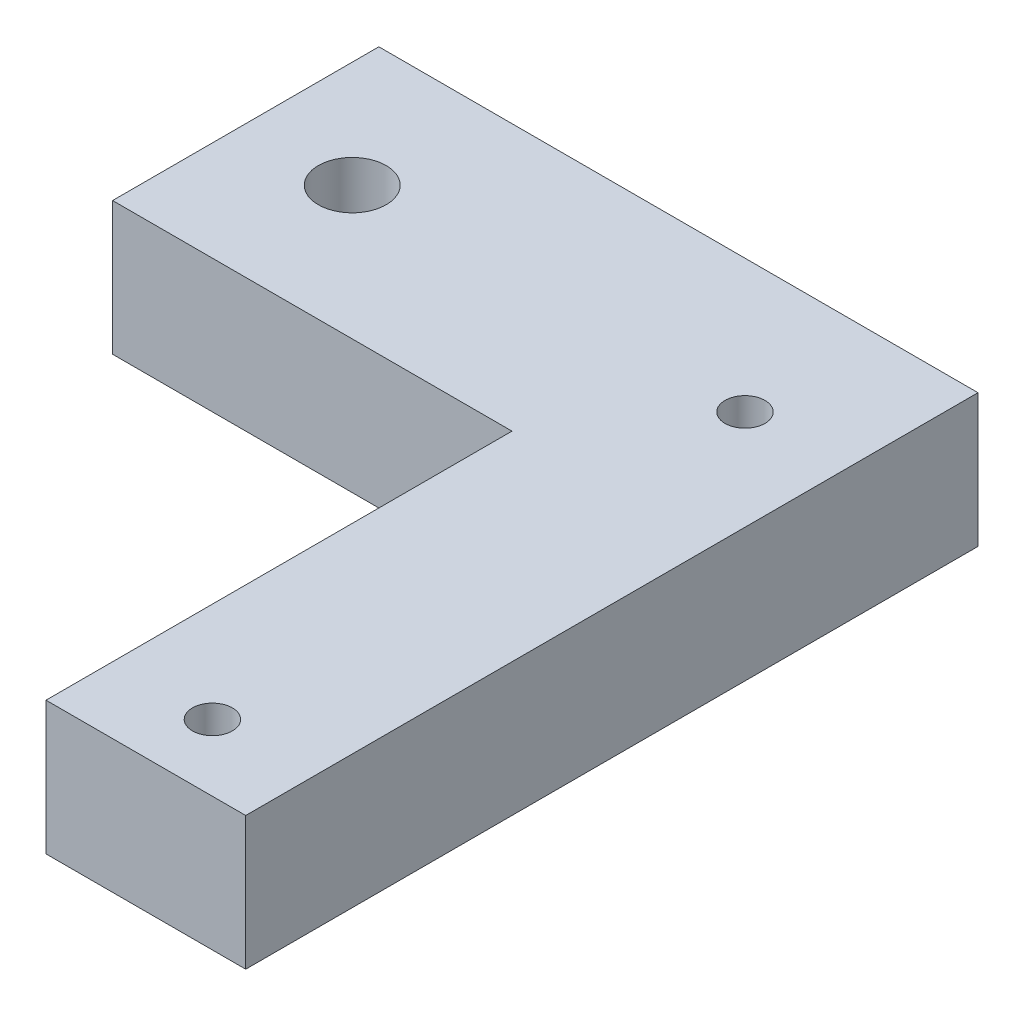
ISO-10303-21;
HEADER;
FILE_DESCRIPTION(('STEP AP214'),'2;1');
FILE_NAME('part.step','',(''),(''),'','','');
FILE_SCHEMA(('AUTOMOTIVE_DESIGN { 1 0 10303 214 1 1 1 1 }'));
ENDSEC;
DATA;
#1=APPLICATION_CONTEXT('core data for automotive mechanical design processes');
#2=APPLICATION_PROTOCOL_DEFINITION('international standard','automotive_design',2000,#1);
#3=PRODUCT_CONTEXT('',#1,'mechanical');
#4=PRODUCT('Part','Part','',(#3));
#5=PRODUCT_RELATED_PRODUCT_CATEGORY('part','',(#4));
#6=PRODUCT_DEFINITION_FORMATION('','',#4);
#7=PRODUCT_DEFINITION_CONTEXT('part definition',#1,'design');
#8=PRODUCT_DEFINITION('design','',#6,#7);
#9=PRODUCT_DEFINITION_SHAPE('','',#8);
#10=(LENGTH_UNIT() NAMED_UNIT(*) SI_UNIT(.MILLI.,.METRE.));
#11=(NAMED_UNIT(*) PLANE_ANGLE_UNIT() SI_UNIT($,.RADIAN.));
#12=(NAMED_UNIT(*) SI_UNIT($,.STERADIAN.) SOLID_ANGLE_UNIT());
#13=UNCERTAINTY_MEASURE_WITH_UNIT(LENGTH_MEASURE(1.E-05),#10,'distance_accuracy_value','');
#14=(GEOMETRIC_REPRESENTATION_CONTEXT(3) GLOBAL_UNCERTAINTY_ASSIGNED_CONTEXT((#13)) GLOBAL_UNIT_ASSIGNED_CONTEXT((#10,
#11,#12)) REPRESENTATION_CONTEXT('',''));
#15=CARTESIAN_POINT('',(0.,0.,0.));
#16=DIRECTION('',(0.,0.,1.));
#17=DIRECTION('',(1.,0.,0.));
#18=AXIS2_PLACEMENT_3D('',#15,#16,#17);
#19=CARTESIAN_POINT('',(7.5,10.,0.));
#20=DIRECTION('',(1.,0.,0.));
#21=DIRECTION('',(0.,0.,-1.));
#22=AXIS2_PLACEMENT_3D('',#19,#20,#21);
#23=PLANE('',#22);
#24=DIRECTION('',(0.,0.,1.));
#25=VECTOR('',#24,1.);
#26=CARTESIAN_POINT('',(7.5,0.,0.));
#27=LINE('',#26,#25);
#28=CARTESIAN_POINT('',(7.5,0.,-27.5));
#29=VERTEX_POINT('',#28);
#30=CARTESIAN_POINT('',(7.5,0.,27.5));
#31=VERTEX_POINT('',#30);
#32=EDGE_CURVE('E130',#29,#31,#27,.T.);
#33=ORIENTED_EDGE('',*,*,#32,.F.);
#34=DIRECTION('',(0.,-1.,0.));
#35=VECTOR('',#34,1.);
#36=CARTESIAN_POINT('',(7.5,10.,-27.5));
#37=LINE('',#36,#35);
#38=CARTESIAN_POINT('',(7.5,10.,-27.5));
#39=VERTEX_POINT('',#38);
#40=EDGE_CURVE('E11',#39,#29,#37,.T.);
#41=ORIENTED_EDGE('',*,*,#40,.F.);
#42=DIRECTION('',(0.,0.,1.));
#43=VECTOR('',#42,1.);
#44=CARTESIAN_POINT('',(7.5,10.,0.));
#45=LINE('',#44,#43);
#46=CARTESIAN_POINT('',(7.5,10.,27.5));
#47=VERTEX_POINT('',#46);
#48=EDGE_CURVE('E278',#39,#47,#45,.T.);
#49=ORIENTED_EDGE('',*,*,#48,.T.);
#50=DIRECTION('',(0.,-1.,0.));
#51=VECTOR('',#50,1.);
#52=CARTESIAN_POINT('',(7.5,10.,27.5));
#53=LINE('',#52,#51);
#54=EDGE_CURVE('E80',#47,#31,#53,.T.);
#55=ORIENTED_EDGE('',*,*,#54,.T.);
#56=EDGE_LOOP('',(#33,#41,#49,#55));
#57=FACE_BOUND('',#56,.T.);
#58=ADVANCED_FACE('F34',(#57),#23,.T.);
#59=CARTESIAN_POINT('',(0.,10.,-27.5));
#60=DIRECTION('',(0.,0.,-1.));
#61=DIRECTION('',(-1.,0.,0.));
#62=AXIS2_PLACEMENT_3D('',#59,#60,#61);
#63=PLANE('',#62);
#64=DIRECTION('',(1.,0.,0.));
#65=VECTOR('',#64,1.);
#66=CARTESIAN_POINT('',(0.,0.,-27.5));
#67=LINE('',#66,#65);
#68=CARTESIAN_POINT('',(-37.5,0.,-27.5));
#69=VERTEX_POINT('',#68);
#70=EDGE_CURVE('E132',#69,#29,#67,.T.);
#71=ORIENTED_EDGE('',*,*,#70,.F.);
#72=DIRECTION('',(0.,-1.,0.));
#73=VECTOR('',#72,1.);
#74=CARTESIAN_POINT('',(-37.5,10.,-27.5));
#75=LINE('',#74,#73);
#76=CARTESIAN_POINT('',(-37.5,10.,-27.5));
#77=VERTEX_POINT('',#76);
#78=EDGE_CURVE('E43',#77,#69,#75,.T.);
#79=ORIENTED_EDGE('',*,*,#78,.F.);
#80=DIRECTION('',(1.,0.,0.));
#81=VECTOR('',#80,1.);
#82=CARTESIAN_POINT('',(0.,10.,-27.5));
#83=LINE('',#82,#81);
#84=EDGE_CURVE('E116',#77,#39,#83,.T.);
#85=ORIENTED_EDGE('',*,*,#84,.T.);
#86=ORIENTED_EDGE('',*,*,#40,.T.);
#87=EDGE_LOOP('',(#71,#79,#85,#86));
#88=FACE_BOUND('',#87,.T.);
#89=ADVANCED_FACE('F156',(#88),#63,.T.);
#90=CARTESIAN_POINT('',(-37.5,10.,0.));
#91=DIRECTION('',(1.,0.,0.));
#92=DIRECTION('',(0.,0.,-1.));
#93=AXIS2_PLACEMENT_3D('',#90,#91,#92);
#94=PLANE('',#93);
#95=DIRECTION('',(0.,0.,1.));
#96=VECTOR('',#95,1.);
#97=CARTESIAN_POINT('',(-37.5,0.,0.));
#98=LINE('',#97,#96);
#99=CARTESIAN_POINT('',(-37.5,0.,-7.49999999999999));
#100=VERTEX_POINT('',#99);
#101=EDGE_CURVE('E135',#69,#100,#98,.T.);
#102=ORIENTED_EDGE('',*,*,#101,.T.);
#103=DIRECTION('',(0.,-1.,0.));
#104=VECTOR('',#103,1.);
#105=CARTESIAN_POINT('',(-37.5,10.,-7.49999999999999));
#106=LINE('',#105,#104);
#107=CARTESIAN_POINT('',(-37.5,10.,-7.49999999999999));
#108=VERTEX_POINT('',#107);
#109=EDGE_CURVE('E102',#108,#100,#106,.T.);
#110=ORIENTED_EDGE('',*,*,#109,.F.);
#111=DIRECTION('',(0.,0.,1.));
#112=VECTOR('',#111,1.);
#113=CARTESIAN_POINT('',(-37.5,10.,0.));
#114=LINE('',#113,#112);
#115=EDGE_CURVE('E113',#77,#108,#114,.T.);
#116=ORIENTED_EDGE('',*,*,#115,.F.);
#117=ORIENTED_EDGE('',*,*,#78,.T.);
#118=EDGE_LOOP('',(#102,#110,#116,#117));
#119=FACE_BOUND('',#118,.T.);
#120=ADVANCED_FACE('F150',(#119),#94,.F.);
#121=CARTESIAN_POINT('',(0.,10.,-7.49999999999999));
#122=DIRECTION('',(0.,0.,1.));
#123=DIRECTION('',(1.,0.,0.));
#124=AXIS2_PLACEMENT_3D('',#121,#122,#123);
#125=PLANE('',#124);
#126=DIRECTION('',(-1.,0.,0.));
#127=VECTOR('',#126,1.);
#128=CARTESIAN_POINT('',(0.,0.,-7.49999999999999));
#129=LINE('',#128,#127);
#130=CARTESIAN_POINT('',(-7.5,0.,-7.49999999999999));
#131=VERTEX_POINT('',#130);
#132=EDGE_CURVE('E99',#131,#100,#129,.T.);
#133=ORIENTED_EDGE('',*,*,#132,.F.);
#134=DIRECTION('',(0.,-1.,0.));
#135=VECTOR('',#134,1.);
#136=CARTESIAN_POINT('',(-7.5,10.,-7.49999999999999));
#137=LINE('',#136,#135);
#138=CARTESIAN_POINT('',(-7.5,10.,-7.49999999999999));
#139=VERTEX_POINT('',#138);
#140=EDGE_CURVE('E93',#139,#131,#137,.T.);
#141=ORIENTED_EDGE('',*,*,#140,.F.);
#142=DIRECTION('',(-1.,0.,0.));
#143=VECTOR('',#142,1.);
#144=CARTESIAN_POINT('',(0.,10.,-7.49999999999999));
#145=LINE('',#144,#143);
#146=EDGE_CURVE('E97',#139,#108,#145,.T.);
#147=ORIENTED_EDGE('',*,*,#146,.T.);
#148=ORIENTED_EDGE('',*,*,#109,.T.);
#149=EDGE_LOOP('',(#133,#141,#147,#148));
#150=FACE_BOUND('',#149,.T.);
#151=ADVANCED_FACE('F95',(#150),#125,.T.);
#152=CARTESIAN_POINT('',(-7.5,10.,0.));
#153=DIRECTION('',(1.,0.,0.));
#154=DIRECTION('',(0.,0.,-1.));
#155=AXIS2_PLACEMENT_3D('',#152,#153,#154);
#156=PLANE('',#155);
#157=DIRECTION('',(0.,0.,1.));
#158=VECTOR('',#157,1.);
#159=CARTESIAN_POINT('',(-7.5,0.,0.));
#160=LINE('',#159,#158);
#161=CARTESIAN_POINT('',(-7.5,0.,27.5));
#162=VERTEX_POINT('',#161);
#163=EDGE_CURVE('E139',#131,#162,#160,.T.);
#164=ORIENTED_EDGE('',*,*,#163,.T.);
#165=DIRECTION('',(0.,-1.,0.));
#166=VECTOR('',#165,1.);
#167=CARTESIAN_POINT('',(-7.5,10.,27.5));
#168=LINE('',#167,#166);
#169=CARTESIAN_POINT('',(-7.5,10.,27.5));
#170=VERTEX_POINT('',#169);
#171=EDGE_CURVE('E103',#170,#162,#168,.T.);
#172=ORIENTED_EDGE('',*,*,#171,.F.);
#173=DIRECTION('',(0.,0.,1.));
#174=VECTOR('',#173,1.);
#175=CARTESIAN_POINT('',(-7.5,10.,0.));
#176=LINE('',#175,#174);
#177=EDGE_CURVE('E106',#139,#170,#176,.T.);
#178=ORIENTED_EDGE('',*,*,#177,.F.);
#179=ORIENTED_EDGE('',*,*,#140,.T.);
#180=EDGE_LOOP('',(#164,#172,#178,#179));
#181=FACE_BOUND('',#180,.T.);
#182=ADVANCED_FACE('F107',(#181),#156,.F.);
#183=CARTESIAN_POINT('',(0.,10.,27.5));
#184=DIRECTION('',(0.,0.,-1.));
#185=DIRECTION('',(-1.,0.,0.));
#186=AXIS2_PLACEMENT_3D('',#183,#184,#185);
#187=PLANE('',#186);
#188=DIRECTION('',(1.,0.,0.));
#189=VECTOR('',#188,1.);
#190=CARTESIAN_POINT('',(0.,0.,27.5));
#191=LINE('',#190,#189);
#192=EDGE_CURVE('E73',#162,#31,#191,.T.);
#193=ORIENTED_EDGE('',*,*,#192,.T.);
#194=ORIENTED_EDGE('',*,*,#54,.F.);
#195=DIRECTION('',(1.,0.,0.));
#196=VECTOR('',#195,1.);
#197=CARTESIAN_POINT('',(0.,10.,27.5));
#198=LINE('',#197,#196);
#199=EDGE_CURVE('E51',#170,#47,#198,.T.);
#200=ORIENTED_EDGE('',*,*,#199,.F.);
#201=ORIENTED_EDGE('',*,*,#171,.T.);
#202=EDGE_LOOP('',(#193,#194,#200,#201));
#203=FACE_BOUND('',#202,.T.);
#204=ADVANCED_FACE('F166',(#203),#187,.F.);
#205=CARTESIAN_POINT('',(0.,10.,-17.5));
#206=DIRECTION('',(0.,-1.,0.));
#207=DIRECTION('',(0.,0.,-1.));
#208=AXIS2_PLACEMENT_3D('',#205,#206,#207);
#209=CYLINDRICAL_SURFACE('',#208,1.5);
#210=CARTESIAN_POINT('',(0.,10.,-17.5));
#211=DIRECTION('',(0.,1.,0.));
#212=DIRECTION('',(0.,0.,1.));
#213=AXIS2_PLACEMENT_3D('',#210,#211,#212);
#214=CIRCLE('',#213,1.5);
#215=CARTESIAN_POINT('',(0.,10.,-16.));
#216=VERTEX_POINT('',#215);
#217=EDGE_CURVE('E179',#216,#216,#214,.T.);
#218=ORIENTED_EDGE('',*,*,#217,.T.);
#219=EDGE_LOOP('',(#218));
#220=FACE_BOUND('',#219,.T.);
#221=CARTESIAN_POINT('',(0.,0.,-17.5));
#222=DIRECTION('',(0.,1.,0.));
#223=DIRECTION('',(0.,0.,1.));
#224=AXIS2_PLACEMENT_3D('',#221,#222,#223);
#225=CIRCLE('',#224,1.5);
#226=CARTESIAN_POINT('',(0.,0.,-16.));
#227=VERTEX_POINT('',#226);
#228=EDGE_CURVE('E127',#227,#227,#225,.T.);
#229=ORIENTED_EDGE('',*,*,#228,.F.);
#230=EDGE_LOOP('',(#229));
#231=FACE_BOUND('',#230,.T.);
#232=ADVANCED_FACE('F164',(#220,#231),#209,.F.);
#233=CARTESIAN_POINT('',(0.,10.,22.5));
#234=DIRECTION('',(0.,-1.,0.));
#235=DIRECTION('',(0.,0.,-1.));
#236=AXIS2_PLACEMENT_3D('',#233,#234,#235);
#237=CYLINDRICAL_SURFACE('',#236,1.5);
#238=CARTESIAN_POINT('',(0.,10.,22.5));
#239=DIRECTION('',(0.,1.,0.));
#240=DIRECTION('',(0.,0.,1.));
#241=AXIS2_PLACEMENT_3D('',#238,#239,#240);
#242=CIRCLE('',#241,1.5);
#243=CARTESIAN_POINT('',(0.,10.,24.));
#244=VERTEX_POINT('',#243);
#245=EDGE_CURVE('E145',#244,#244,#242,.T.);
#246=ORIENTED_EDGE('',*,*,#245,.T.);
#247=EDGE_LOOP('',(#246));
#248=FACE_BOUND('',#247,.T.);
#249=CARTESIAN_POINT('',(0.,0.,22.5));
#250=DIRECTION('',(0.,1.,0.));
#251=DIRECTION('',(0.,0.,1.));
#252=AXIS2_PLACEMENT_3D('',#249,#250,#251);
#253=CIRCLE('',#252,1.5);
#254=CARTESIAN_POINT('',(0.,0.,24.));
#255=VERTEX_POINT('',#254);
#256=EDGE_CURVE('E124',#255,#255,#253,.T.);
#257=ORIENTED_EDGE('',*,*,#256,.F.);
#258=EDGE_LOOP('',(#257));
#259=FACE_BOUND('',#258,.T.);
#260=ADVANCED_FACE('F36',(#248,#259),#237,.F.);
#261=CARTESIAN_POINT('',(-29.5,10.,-17.5));
#262=DIRECTION('',(0.,-1.,0.));
#263=DIRECTION('',(0.,0.,-1.));
#264=AXIS2_PLACEMENT_3D('',#261,#262,#263);
#265=CYLINDRICAL_SURFACE('',#264,2.55);
#266=CARTESIAN_POINT('',(-29.5,10.,-17.5));
#267=DIRECTION('',(0.,1.,0.));
#268=DIRECTION('',(0.,0.,1.));
#269=AXIS2_PLACEMENT_3D('',#266,#267,#268);
#270=CIRCLE('',#269,2.55);
#271=CARTESIAN_POINT('',(-29.5,10.,-14.95));
#272=VERTEX_POINT('',#271);
#273=EDGE_CURVE('E121',#272,#272,#270,.T.);
#274=ORIENTED_EDGE('',*,*,#273,.T.);
#275=EDGE_LOOP('',(#274));
#276=FACE_BOUND('',#275,.T.);
#277=CARTESIAN_POINT('',(-29.5,0.,-17.5));
#278=DIRECTION('',(0.,1.,0.));
#279=DIRECTION('',(0.,0.,1.));
#280=AXIS2_PLACEMENT_3D('',#277,#278,#279);
#281=CIRCLE('',#280,2.55);
#282=CARTESIAN_POINT('',(-29.5,0.,-14.95));
#283=VERTEX_POINT('',#282);
#284=EDGE_CURVE('E142',#283,#283,#281,.T.);
#285=ORIENTED_EDGE('',*,*,#284,.F.);
#286=EDGE_LOOP('',(#285));
#287=FACE_BOUND('',#286,.T.);
#288=ADVANCED_FACE('F172',(#276,#287),#265,.F.);
#289=CARTESIAN_POINT('',(0.,10.,0.));
#290=DIRECTION('',(0.,1.,0.));
#291=DIRECTION('',(0.,0.,1.));
#292=AXIS2_PLACEMENT_3D('',#289,#290,#291);
#293=PLANE('',#292);
#294=ORIENTED_EDGE('',*,*,#245,.F.);
#295=EDGE_LOOP('',(#294));
#296=FACE_BOUND('',#295,.T.);
#297=ORIENTED_EDGE('',*,*,#217,.F.);
#298=EDGE_LOOP('',(#297));
#299=FACE_BOUND('',#298,.T.);
#300=ORIENTED_EDGE('',*,*,#48,.F.);
#301=ORIENTED_EDGE('',*,*,#84,.F.);
#302=ORIENTED_EDGE('',*,*,#115,.T.);
#303=ORIENTED_EDGE('',*,*,#146,.F.);
#304=ORIENTED_EDGE('',*,*,#177,.T.);
#305=ORIENTED_EDGE('',*,*,#199,.T.);
#306=EDGE_LOOP('',(#300,#301,#302,#303,#304,#305));
#307=FACE_BOUND('',#306,.T.);
#308=ORIENTED_EDGE('',*,*,#273,.F.);
#309=EDGE_LOOP('',(#308));
#310=FACE_BOUND('',#309,.T.);
#311=ADVANCED_FACE('F109',(#296,#299,#307,#310),#293,.T.);
#312=CARTESIAN_POINT('',(0.,0.,0.));
#313=DIRECTION('',(0.,1.,0.));
#314=DIRECTION('',(0.,0.,1.));
#315=AXIS2_PLACEMENT_3D('',#312,#313,#314);
#316=PLANE('',#315);
#317=ORIENTED_EDGE('',*,*,#256,.T.);
#318=EDGE_LOOP('',(#317));
#319=FACE_BOUND('',#318,.T.);
#320=ORIENTED_EDGE('',*,*,#228,.T.);
#321=EDGE_LOOP('',(#320));
#322=FACE_BOUND('',#321,.T.);
#323=ORIENTED_EDGE('',*,*,#32,.T.);
#324=ORIENTED_EDGE('',*,*,#192,.F.);
#325=ORIENTED_EDGE('',*,*,#163,.F.);
#326=ORIENTED_EDGE('',*,*,#132,.T.);
#327=ORIENTED_EDGE('',*,*,#101,.F.);
#328=ORIENTED_EDGE('',*,*,#70,.T.);
#329=EDGE_LOOP('',(#323,#324,#325,#326,#327,#328));
#330=FACE_BOUND('',#329,.T.);
#331=ORIENTED_EDGE('',*,*,#284,.T.);
#332=EDGE_LOOP('',(#331));
#333=FACE_BOUND('',#332,.T.);
#334=ADVANCED_FACE('F154',(#319,#322,#330,#333),#316,.F.);
#335=CLOSED_SHELL('',(#58,#89,#120,#151,#182,#204,#232,#260,#288,#311,#334));
#336=MANIFOLD_SOLID_BREP('B2',#335);
#337=ADVANCED_BREP_SHAPE_REPRESENTATION('',(#18,#336),#14);
#338=SHAPE_DEFINITION_REPRESENTATION(#9,#337);
ENDSEC;
END-ISO-10303-21;
